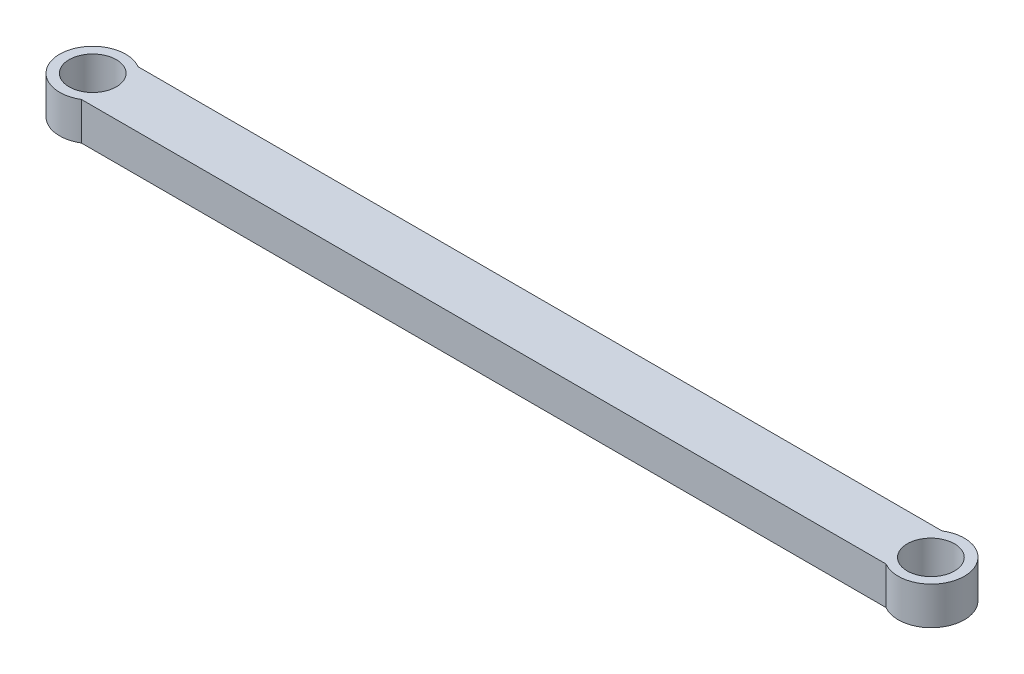
ISO-10303-21;
HEADER;
FILE_DESCRIPTION(('STEP AP214'),'2;1');
FILE_NAME('part.step','',(''),(''),'','','');
FILE_SCHEMA(('AUTOMOTIVE_DESIGN { 1 0 10303 214 1 1 1 1 }'));
ENDSEC;
DATA;
#1=APPLICATION_CONTEXT('core data for automotive mechanical design processes');
#2=APPLICATION_PROTOCOL_DEFINITION('international standard','automotive_design',2000,#1);
#3=PRODUCT_CONTEXT('',#1,'mechanical');
#4=PRODUCT('Part','Part','',(#3));
#5=PRODUCT_RELATED_PRODUCT_CATEGORY('part','',(#4));
#6=PRODUCT_DEFINITION_FORMATION('','',#4);
#7=PRODUCT_DEFINITION_CONTEXT('part definition',#1,'design');
#8=PRODUCT_DEFINITION('design','',#6,#7);
#9=PRODUCT_DEFINITION_SHAPE('','',#8);
#10=(LENGTH_UNIT() NAMED_UNIT(*) SI_UNIT(.MILLI.,.METRE.));
#11=(NAMED_UNIT(*) PLANE_ANGLE_UNIT() SI_UNIT($,.RADIAN.));
#12=(NAMED_UNIT(*) SI_UNIT($,.STERADIAN.) SOLID_ANGLE_UNIT());
#13=UNCERTAINTY_MEASURE_WITH_UNIT(LENGTH_MEASURE(1.E-05),#10,'distance_accuracy_value','');
#14=(GEOMETRIC_REPRESENTATION_CONTEXT(3) GLOBAL_UNCERTAINTY_ASSIGNED_CONTEXT((#13)) GLOBAL_UNIT_ASSIGNED_CONTEXT((#10,
#11,#12)) REPRESENTATION_CONTEXT('',''));
#15=CARTESIAN_POINT('',(0.,0.,0.));
#16=DIRECTION('',(0.,0.,1.));
#17=DIRECTION('',(1.,0.,0.));
#18=AXIS2_PLACEMENT_3D('',#15,#16,#17);
#19=CARTESIAN_POINT('',(0.,2.,1.5));
#20=DIRECTION('',(0.,0.,-1.));
#21=DIRECTION('',(-1.,0.,0.));
#22=AXIS2_PLACEMENT_3D('',#19,#20,#21);
#23=PLANE('',#22);
#24=DIRECTION('',(1.,0.,0.));
#25=VECTOR('',#24,1.);
#26=CARTESIAN_POINT('',(0.,0.,1.5));
#27=LINE('',#26,#25);
#28=CARTESIAN_POINT('',(0.901387818865998,0.,1.5));
#29=VERTEX_POINT('',#28);
#30=CARTESIAN_POINT('',(43.4998455410051,0.,1.5));
#31=VERTEX_POINT('',#30);
#32=EDGE_CURVE('E120',#29,#31,#27,.T.);
#33=ORIENTED_EDGE('',*,*,#32,.T.);
#34=DIRECTION('',(0.,-1.,0.));
#35=VECTOR('',#34,1.);
#36=CARTESIAN_POINT('',(43.4998455410051,2.,1.5));
#37=LINE('',#36,#35);
#38=CARTESIAN_POINT('',(43.4998455410051,2.,1.5));
#39=VERTEX_POINT('',#38);
#40=EDGE_CURVE('E11',#39,#31,#37,.T.);
#41=ORIENTED_EDGE('',*,*,#40,.F.);
#42=DIRECTION('',(1.,0.,0.));
#43=VECTOR('',#42,1.);
#44=CARTESIAN_POINT('',(0.,2.,1.5));
#45=LINE('',#44,#43);
#46=CARTESIAN_POINT('',(0.901387818865998,2.,1.5));
#47=VERTEX_POINT('',#46);
#48=EDGE_CURVE('E93',#47,#39,#45,.T.);
#49=ORIENTED_EDGE('',*,*,#48,.F.);
#50=DIRECTION('',(0.,-1.,0.));
#51=VECTOR('',#50,1.);
#52=CARTESIAN_POINT('',(0.901387818865998,2.,1.5));
#53=LINE('',#52,#51);
#54=EDGE_CURVE('E119',#47,#29,#53,.T.);
#55=ORIENTED_EDGE('',*,*,#54,.T.);
#56=EDGE_LOOP('',(#33,#41,#49,#55));
#57=FACE_BOUND('',#56,.T.);
#58=ADVANCED_FACE('F44',(#57),#23,.F.);
#59=CARTESIAN_POINT('',(44.3835054520691,2.,-0.0105115562545324));
#60=DIRECTION('',(0.,-1.,0.));
#61=DIRECTION('',(0.,0.,-1.));
#62=AXIS2_PLACEMENT_3D('',#59,#60,#61);
#63=CYLINDRICAL_SURFACE('',#62,1.75);
#64=CARTESIAN_POINT('',(44.3835054520691,0.,-0.0105115562545324));
#65=DIRECTION('',(0.,1.,0.));
#66=DIRECTION('',(0.,0.,1.));
#67=AXIS2_PLACEMENT_3D('',#64,#65,#66);
#68=CIRCLE('',#67,1.75);
#69=CARTESIAN_POINT('',(43.46485199404,0.,-1.5));
#70=VERTEX_POINT('',#69);
#71=EDGE_CURVE('E99',#31,#70,#68,.T.);
#72=ORIENTED_EDGE('',*,*,#71,.T.);
#73=DIRECTION('',(0.,-1.,0.));
#74=VECTOR('',#73,1.);
#75=CARTESIAN_POINT('',(43.46485199404,2.,-1.5));
#76=LINE('',#75,#74);
#77=CARTESIAN_POINT('',(43.46485199404,2.,-1.5));
#78=VERTEX_POINT('',#77);
#79=EDGE_CURVE('E53',#78,#70,#76,.T.);
#80=ORIENTED_EDGE('',*,*,#79,.F.);
#81=CARTESIAN_POINT('',(44.3835054520691,2.,-0.0105115562545324));
#82=DIRECTION('',(0.,1.,0.));
#83=DIRECTION('',(0.,0.,1.));
#84=AXIS2_PLACEMENT_3D('',#81,#82,#83);
#85=CIRCLE('',#84,1.75);
#86=EDGE_CURVE('E87',#39,#78,#85,.T.);
#87=ORIENTED_EDGE('',*,*,#86,.F.);
#88=ORIENTED_EDGE('',*,*,#40,.T.);
#89=EDGE_LOOP('',(#72,#80,#87,#88));
#90=FACE_BOUND('',#89,.T.);
#91=ADVANCED_FACE('F98',(#90),#63,.T.);
#92=CARTESIAN_POINT('',(0.,2.,-1.5));
#93=DIRECTION('',(0.,0.,-1.));
#94=DIRECTION('',(-1.,0.,0.));
#95=AXIS2_PLACEMENT_3D('',#92,#93,#94);
#96=PLANE('',#95);
#97=DIRECTION('',(1.,0.,0.));
#98=VECTOR('',#97,1.);
#99=CARTESIAN_POINT('',(0.,0.,-1.5));
#100=LINE('',#99,#98);
#101=CARTESIAN_POINT('',(0.901387818865998,0.,-1.5));
#102=VERTEX_POINT('',#101);
#103=EDGE_CURVE('E126',#102,#70,#100,.T.);
#104=ORIENTED_EDGE('',*,*,#103,.F.);
#105=DIRECTION('',(0.,-1.,0.));
#106=VECTOR('',#105,1.);
#107=CARTESIAN_POINT('',(0.901387818865998,2.,-1.5));
#108=LINE('',#107,#106);
#109=CARTESIAN_POINT('',(0.901387818865998,2.,-1.5));
#110=VERTEX_POINT('',#109);
#111=EDGE_CURVE('E77',#110,#102,#108,.T.);
#112=ORIENTED_EDGE('',*,*,#111,.F.);
#113=DIRECTION('',(1.,0.,0.));
#114=VECTOR('',#113,1.);
#115=CARTESIAN_POINT('',(0.,2.,-1.5));
#116=LINE('',#115,#114);
#117=EDGE_CURVE('E91',#110,#78,#116,.T.);
#118=ORIENTED_EDGE('',*,*,#117,.T.);
#119=ORIENTED_EDGE('',*,*,#79,.T.);
#120=EDGE_LOOP('',(#104,#112,#118,#119));
#121=FACE_BOUND('',#120,.T.);
#122=ADVANCED_FACE('F104',(#121),#96,.T.);
#123=CARTESIAN_POINT('',(44.3835054520691,2.,0.0105115562545301));
#124=DIRECTION('',(0.,-1.,0.));
#125=DIRECTION('',(0.,0.,-1.));
#126=AXIS2_PLACEMENT_3D('',#123,#124,#125);
#127=CYLINDRICAL_SURFACE('',#126,1.25);
#128=CARTESIAN_POINT('',(44.3835054520691,2.,0.0105115562545301));
#129=DIRECTION('',(0.,1.,0.));
#130=DIRECTION('',(0.,0.,1.));
#131=AXIS2_PLACEMENT_3D('',#128,#129,#130);
#132=CIRCLE('',#131,1.25);
#133=CARTESIAN_POINT('',(44.3835054520691,2.,1.26051155625453));
#134=VERTEX_POINT('',#133);
#135=EDGE_CURVE('E108',#134,#134,#132,.T.);
#136=ORIENTED_EDGE('',*,*,#135,.T.);
#137=EDGE_LOOP('',(#136));
#138=FACE_BOUND('',#137,.T.);
#139=CARTESIAN_POINT('',(44.3835054520691,0.,0.0105115562545301));
#140=DIRECTION('',(0.,1.,0.));
#141=DIRECTION('',(0.,0.,1.));
#142=AXIS2_PLACEMENT_3D('',#139,#140,#141);
#143=CIRCLE('',#142,1.25);
#144=CARTESIAN_POINT('',(44.3835054520691,0.,1.26051155625453));
#145=VERTEX_POINT('',#144);
#146=EDGE_CURVE('E131',#145,#145,#143,.T.);
#147=ORIENTED_EDGE('',*,*,#146,.F.);
#148=EDGE_LOOP('',(#147));
#149=FACE_BOUND('',#148,.T.);
#150=ADVANCED_FACE('F163',(#138,#149),#127,.F.);
#151=CARTESIAN_POINT('',(0.,2.,0.));
#152=DIRECTION('',(0.,-1.,0.));
#153=DIRECTION('',(0.,0.,-1.));
#154=AXIS2_PLACEMENT_3D('',#151,#152,#153);
#155=CYLINDRICAL_SURFACE('',#154,1.75);
#156=CARTESIAN_POINT('',(0.,0.,0.));
#157=DIRECTION('',(0.,1.,0.));
#158=DIRECTION('',(0.,0.,1.));
#159=AXIS2_PLACEMENT_3D('',#156,#157,#158);
#160=CIRCLE('',#159,1.75);
#161=EDGE_CURVE('E80',#102,#29,#160,.T.);
#162=ORIENTED_EDGE('',*,*,#161,.T.);
#163=ORIENTED_EDGE('',*,*,#54,.F.);
#164=CARTESIAN_POINT('',(0.,2.,0.));
#165=DIRECTION('',(0.,1.,0.));
#166=DIRECTION('',(0.,0.,1.));
#167=AXIS2_PLACEMENT_3D('',#164,#165,#166);
#168=CIRCLE('',#167,1.75);
#169=EDGE_CURVE('E61',#110,#47,#168,.T.);
#170=ORIENTED_EDGE('',*,*,#169,.F.);
#171=ORIENTED_EDGE('',*,*,#111,.T.);
#172=EDGE_LOOP('',(#162,#163,#170,#171));
#173=FACE_BOUND('',#172,.T.);
#174=ADVANCED_FACE('F155',(#173),#155,.T.);
#175=CARTESIAN_POINT('',(0.,2.,0.));
#176=DIRECTION('',(0.,-1.,0.));
#177=DIRECTION('',(0.,0.,-1.));
#178=AXIS2_PLACEMENT_3D('',#175,#176,#177);
#179=CYLINDRICAL_SURFACE('',#178,1.25);
#180=CARTESIAN_POINT('',(0.,2.,0.));
#181=DIRECTION('',(0.,1.,0.));
#182=DIRECTION('',(0.,0.,1.));
#183=AXIS2_PLACEMENT_3D('',#180,#181,#182);
#184=CIRCLE('',#183,1.25);
#185=CARTESIAN_POINT('',(0.,2.,1.25));
#186=VERTEX_POINT('',#185);
#187=EDGE_CURVE('E115',#186,#186,#184,.T.);
#188=ORIENTED_EDGE('',*,*,#187,.T.);
#189=EDGE_LOOP('',(#188));
#190=FACE_BOUND('',#189,.T.);
#191=CARTESIAN_POINT('',(0.,0.,0.));
#192=DIRECTION('',(0.,1.,0.));
#193=DIRECTION('',(0.,0.,1.));
#194=AXIS2_PLACEMENT_3D('',#191,#192,#193);
#195=CIRCLE('',#194,1.25);
#196=CARTESIAN_POINT('',(0.,0.,1.25));
#197=VERTEX_POINT('',#196);
#198=EDGE_CURVE('E135',#197,#197,#195,.T.);
#199=ORIENTED_EDGE('',*,*,#198,.F.);
#200=EDGE_LOOP('',(#199));
#201=FACE_BOUND('',#200,.T.);
#202=ADVANCED_FACE('F153',(#190,#201),#179,.F.);
#203=CARTESIAN_POINT('',(0.,2.,0.));
#204=DIRECTION('',(0.,1.,0.));
#205=DIRECTION('',(0.,0.,1.));
#206=AXIS2_PLACEMENT_3D('',#203,#204,#205);
#207=PLANE('',#206);
#208=ORIENTED_EDGE('',*,*,#48,.T.);
#209=ORIENTED_EDGE('',*,*,#86,.T.);
#210=ORIENTED_EDGE('',*,*,#117,.F.);
#211=ORIENTED_EDGE('',*,*,#169,.T.);
#212=EDGE_LOOP('',(#208,#209,#210,#211));
#213=FACE_BOUND('',#212,.T.);
#214=ORIENTED_EDGE('',*,*,#135,.F.);
#215=EDGE_LOOP('',(#214));
#216=FACE_BOUND('',#215,.T.);
#217=ORIENTED_EDGE('',*,*,#187,.F.);
#218=EDGE_LOOP('',(#217));
#219=FACE_BOUND('',#218,.T.);
#220=ADVANCED_FACE('F88',(#213,#216,#219),#207,.T.);
#221=CARTESIAN_POINT('',(0.,0.,0.));
#222=DIRECTION('',(0.,1.,0.));
#223=DIRECTION('',(0.,0.,1.));
#224=AXIS2_PLACEMENT_3D('',#221,#222,#223);
#225=PLANE('',#224);
#226=ORIENTED_EDGE('',*,*,#32,.F.);
#227=ORIENTED_EDGE('',*,*,#161,.F.);
#228=ORIENTED_EDGE('',*,*,#103,.T.);
#229=ORIENTED_EDGE('',*,*,#71,.F.);
#230=EDGE_LOOP('',(#226,#227,#228,#229));
#231=FACE_BOUND('',#230,.T.);
#232=ORIENTED_EDGE('',*,*,#146,.T.);
#233=EDGE_LOOP('',(#232));
#234=FACE_BOUND('',#233,.T.);
#235=ORIENTED_EDGE('',*,*,#198,.T.);
#236=EDGE_LOOP('',(#235));
#237=FACE_BOUND('',#236,.T.);
#238=ADVANCED_FACE('F145',(#231,#234,#237),#225,.F.);
#239=CLOSED_SHELL('',(#58,#91,#122,#150,#174,#202,#220,#238));
#240=MANIFOLD_SOLID_BREP('B2',#239);
#241=ADVANCED_BREP_SHAPE_REPRESENTATION('',(#18,#240),#14);
#242=SHAPE_DEFINITION_REPRESENTATION(#9,#241);
ENDSEC;
END-ISO-10303-21;
